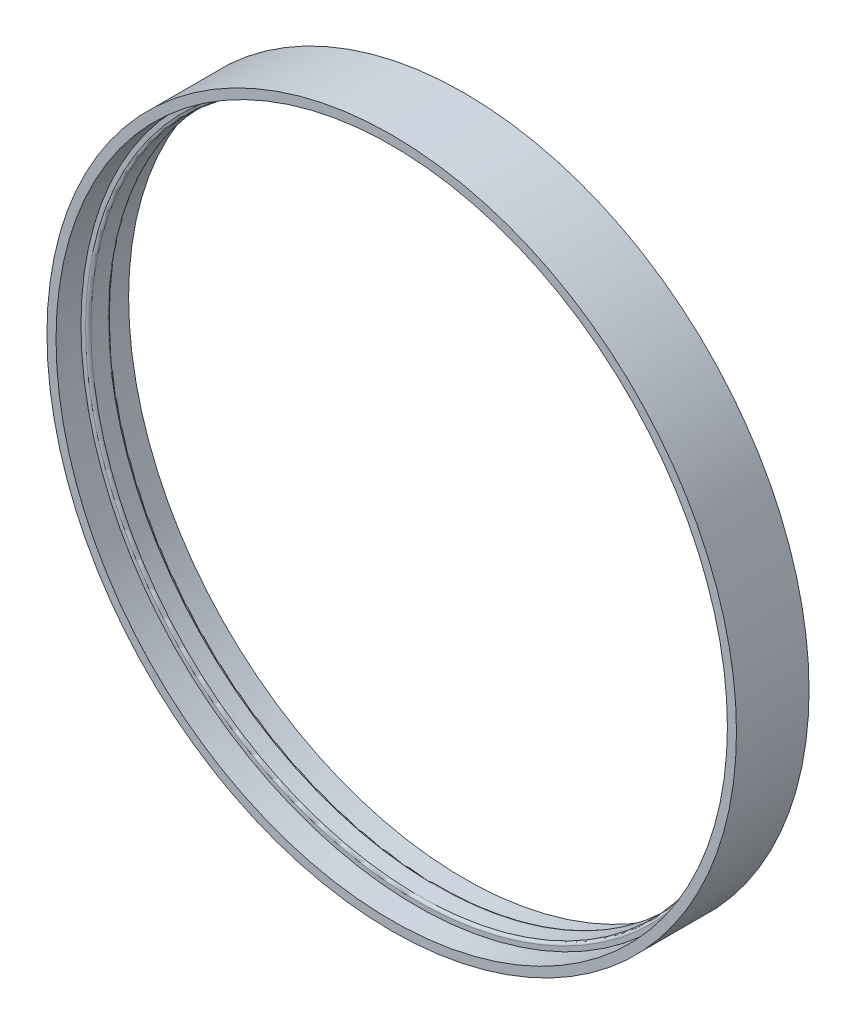
ISO-10303-21;
HEADER;
FILE_DESCRIPTION(('STEP AP214'),'2;1');
FILE_NAME('part.step','',(''),(''),'','','');
FILE_SCHEMA(('AUTOMOTIVE_DESIGN { 1 0 10303 214 1 1 1 1 }'));
ENDSEC;
DATA;
#1=APPLICATION_CONTEXT('core data for automotive mechanical design processes');
#2=APPLICATION_PROTOCOL_DEFINITION('international standard','automotive_design',2000,#1);
#3=PRODUCT_CONTEXT('',#1,'mechanical');
#4=PRODUCT('Part','Part','',(#3));
#5=PRODUCT_RELATED_PRODUCT_CATEGORY('part','',(#4));
#6=PRODUCT_DEFINITION_FORMATION('','',#4);
#7=PRODUCT_DEFINITION_CONTEXT('part definition',#1,'design');
#8=PRODUCT_DEFINITION('design','',#6,#7);
#9=PRODUCT_DEFINITION_SHAPE('','',#8);
#10=(LENGTH_UNIT() NAMED_UNIT(*) SI_UNIT(.MILLI.,.METRE.));
#11=(NAMED_UNIT(*) PLANE_ANGLE_UNIT() SI_UNIT($,.RADIAN.));
#12=(NAMED_UNIT(*) SI_UNIT($,.STERADIAN.) SOLID_ANGLE_UNIT());
#13=UNCERTAINTY_MEASURE_WITH_UNIT(LENGTH_MEASURE(1.E-05),#10,'distance_accuracy_value','');
#14=(GEOMETRIC_REPRESENTATION_CONTEXT(3) GLOBAL_UNCERTAINTY_ASSIGNED_CONTEXT((#13)) GLOBAL_UNIT_ASSIGNED_CONTEXT((#10,
#11,#12)) REPRESENTATION_CONTEXT('',''));
#15=CARTESIAN_POINT('',(0.,0.,0.));
#16=DIRECTION('',(0.,0.,1.));
#17=DIRECTION('',(1.,0.,0.));
#18=AXIS2_PLACEMENT_3D('',#15,#16,#17);
#19=CARTESIAN_POINT('',(0.,0.,-11.176));
#20=DIRECTION('',(0.,0.,-1.));
#21=DIRECTION('',(-1.,0.,0.));
#22=AXIS2_PLACEMENT_3D('',#19,#20,#21);
#23=CYLINDRICAL_SURFACE('',#22,93.98);
#24=CARTESIAN_POINT('',(0.,0.,-10.16));
#25=DIRECTION('',(0.,0.,-1.));
#26=DIRECTION('',(-1.,0.,0.));
#27=AXIS2_PLACEMENT_3D('',#24,#25,#26);
#28=CIRCLE('',#27,93.98);
#29=CARTESIAN_POINT('',(-93.98,0.,-10.16));
#30=VERTEX_POINT('',#29);
#31=EDGE_CURVE('E10',#30,#30,#28,.T.);
#32=ORIENTED_EDGE('',*,*,#31,.T.);
#33=EDGE_LOOP('',(#32));
#34=FACE_BOUND('',#33,.T.);
#35=CARTESIAN_POINT('',(0.,0.,-3.175));
#36=DIRECTION('',(0.,0.,-1.));
#37=DIRECTION('',(-1.,0.,0.));
#38=AXIS2_PLACEMENT_3D('',#35,#36,#37);
#39=CIRCLE('',#38,93.98);
#40=CARTESIAN_POINT('',(-93.98,0.,-3.175));
#41=VERTEX_POINT('',#40);
#42=EDGE_CURVE('E80',#41,#41,#39,.T.);
#43=ORIENTED_EDGE('',*,*,#42,.F.);
#44=EDGE_LOOP('',(#43));
#45=FACE_BOUND('',#44,.T.);
#46=ADVANCED_FACE('F37',(#34,#45),#23,.F.);
#47=CARTESIAN_POINT('',(0.,96.52,-10.16));
#48=DIRECTION('',(0.,0.,-1.));
#49=DIRECTION('',(-1.,0.,0.));
#50=AXIS2_PLACEMENT_3D('',#47,#48,#49);
#51=PLANE('',#50);
#52=CARTESIAN_POINT('',(0.,0.,-10.16));
#53=DIRECTION('',(0.,0.,-1.));
#54=DIRECTION('',(-1.,0.,0.));
#55=AXIS2_PLACEMENT_3D('',#52,#53,#54);
#56=CIRCLE('',#55,96.52);
#57=CARTESIAN_POINT('',(-96.52,0.,-10.16));
#58=VERTEX_POINT('',#57);
#59=EDGE_CURVE('E44',#58,#58,#56,.T.);
#60=ORIENTED_EDGE('',*,*,#59,.T.);
#61=EDGE_LOOP('',(#60));
#62=FACE_BOUND('',#61,.T.);
#63=ORIENTED_EDGE('',*,*,#31,.F.);
#64=EDGE_LOOP('',(#63));
#65=FACE_BOUND('',#64,.T.);
#66=ADVANCED_FACE('F89',(#62,#65),#51,.T.);
#67=CARTESIAN_POINT('',(0.,0.,-11.176));
#68=DIRECTION('',(0.,0.,-1.));
#69=DIRECTION('',(-1.,0.,0.));
#70=AXIS2_PLACEMENT_3D('',#67,#68,#69);
#71=CYLINDRICAL_SURFACE('',#70,96.52);
#72=CARTESIAN_POINT('',(0.,0.,10.16));
#73=DIRECTION('',(0.,0.,-1.));
#74=DIRECTION('',(-1.,0.,0.));
#75=AXIS2_PLACEMENT_3D('',#72,#73,#74);
#76=CIRCLE('',#75,96.52);
#77=CARTESIAN_POINT('',(-96.52,0.,10.16));
#78=VERTEX_POINT('',#77);
#79=EDGE_CURVE('E49',#78,#78,#76,.T.);
#80=ORIENTED_EDGE('',*,*,#79,.T.);
#81=EDGE_LOOP('',(#80));
#82=FACE_BOUND('',#81,.T.);
#83=ORIENTED_EDGE('',*,*,#59,.F.);
#84=EDGE_LOOP('',(#83));
#85=FACE_BOUND('',#84,.T.);
#86=ADVANCED_FACE('F93',(#82,#85),#71,.T.);
#87=CARTESIAN_POINT('',(0.,96.52,10.16));
#88=DIRECTION('',(0.,0.,1.));
#89=DIRECTION('',(1.,0.,0.));
#90=AXIS2_PLACEMENT_3D('',#87,#88,#89);
#91=PLANE('',#90);
#92=CARTESIAN_POINT('',(0.,0.,10.16));
#93=DIRECTION('',(0.,0.,-1.));
#94=DIRECTION('',(-1.,0.,0.));
#95=AXIS2_PLACEMENT_3D('',#92,#93,#94);
#96=CIRCLE('',#95,93.98);
#97=CARTESIAN_POINT('',(-93.98,0.,10.16));
#98=VERTEX_POINT('',#97);
#99=EDGE_CURVE('E54',#98,#98,#96,.T.);
#100=ORIENTED_EDGE('',*,*,#99,.T.);
#101=EDGE_LOOP('',(#100));
#102=FACE_BOUND('',#101,.T.);
#103=ORIENTED_EDGE('',*,*,#79,.F.);
#104=EDGE_LOOP('',(#103));
#105=FACE_BOUND('',#104,.T.);
#106=ADVANCED_FACE('F97',(#102,#105),#91,.T.);
#107=CARTESIAN_POINT('',(0.,0.,-11.176));
#108=DIRECTION('',(0.,0.,-1.));
#109=DIRECTION('',(-1.,0.,0.));
#110=AXIS2_PLACEMENT_3D('',#107,#108,#109);
#111=CYLINDRICAL_SURFACE('',#110,93.98);
#112=CARTESIAN_POINT('',(0.,0.,3.175));
#113=DIRECTION('',(0.,0.,-1.));
#114=DIRECTION('',(-1.,0.,0.));
#115=AXIS2_PLACEMENT_3D('',#112,#113,#114);
#116=CIRCLE('',#115,93.98);
#117=CARTESIAN_POINT('',(-93.98,0.,3.175));
#118=VERTEX_POINT('',#117);
#119=EDGE_CURVE('E60',#118,#118,#116,.T.);
#120=ORIENTED_EDGE('',*,*,#119,.T.);
#121=EDGE_LOOP('',(#120));
#122=FACE_BOUND('',#121,.T.);
#123=ORIENTED_EDGE('',*,*,#99,.F.);
#124=EDGE_LOOP('',(#123));
#125=FACE_BOUND('',#124,.T.);
#126=ADVANCED_FACE('F104',(#122,#125),#111,.F.);
#127=CARTESIAN_POINT('',(0.,93.98,3.175));
#128=DIRECTION('',(0.,0.,1.));
#129=DIRECTION('',(1.,0.,0.));
#130=AXIS2_PLACEMENT_3D('',#127,#128,#129);
#131=PLANE('',#130);
#132=CARTESIAN_POINT('',(0.,0.,3.175));
#133=DIRECTION('',(0.,0.,-1.));
#134=DIRECTION('',(-1.,0.,0.));
#135=AXIS2_PLACEMENT_3D('',#132,#133,#134);
#136=CIRCLE('',#135,92.71);
#137=CARTESIAN_POINT('',(-92.71,0.,3.175));
#138=VERTEX_POINT('',#137);
#139=EDGE_CURVE('E64',#138,#138,#136,.T.);
#140=ORIENTED_EDGE('',*,*,#139,.T.);
#141=EDGE_LOOP('',(#140));
#142=FACE_BOUND('',#141,.T.);
#143=ORIENTED_EDGE('',*,*,#119,.F.);
#144=EDGE_LOOP('',(#143));
#145=FACE_BOUND('',#144,.T.);
#146=ADVANCED_FACE('F108',(#142,#145),#131,.T.);
#147=CARTESIAN_POINT('',(0.,0.,2.413));
#148=DIRECTION('',(0.,0.,-1.));
#149=DIRECTION('',(-1.,0.,0.));
#150=AXIS2_PLACEMENT_3D('',#147,#148,#149);
#151=TOROIDAL_SURFACE('',#150,92.71,0.761999999999999);
#152=CARTESIAN_POINT('',(0.,0.,2.41299999999999));
#153=DIRECTION('',(0.,0.,-1.));
#154=DIRECTION('',(-1.,0.,0.));
#155=AXIS2_PLACEMENT_3D('',#152,#153,#154);
#156=CIRCLE('',#155,91.948);
#157=CARTESIAN_POINT('',(-91.948,0.,2.41299999999999));
#158=VERTEX_POINT('',#157);
#159=EDGE_CURVE('E68',#158,#158,#156,.T.);
#160=ORIENTED_EDGE('',*,*,#159,.T.);
#161=EDGE_LOOP('',(#160));
#162=FACE_BOUND('',#161,.T.);
#163=ORIENTED_EDGE('',*,*,#139,.F.);
#164=EDGE_LOOP('',(#163));
#165=FACE_BOUND('',#164,.T.);
#166=ADVANCED_FACE('F112',(#162,#165),#151,.T.);
#167=CARTESIAN_POINT('',(0.,0.,-11.176));
#168=DIRECTION('',(0.,0.,-1.));
#169=DIRECTION('',(-1.,0.,0.));
#170=AXIS2_PLACEMENT_3D('',#167,#168,#169);
#171=CYLINDRICAL_SURFACE('',#170,91.948);
#172=CARTESIAN_POINT('',(0.,0.,-2.41299999999999));
#173=DIRECTION('',(0.,0.,-1.));
#174=DIRECTION('',(-1.,0.,0.));
#175=AXIS2_PLACEMENT_3D('',#172,#173,#174);
#176=CIRCLE('',#175,91.948);
#177=CARTESIAN_POINT('',(-91.948,0.,-2.41299999999999));
#178=VERTEX_POINT('',#177);
#179=EDGE_CURVE('E72',#178,#178,#176,.T.);
#180=ORIENTED_EDGE('',*,*,#179,.T.);
#181=EDGE_LOOP('',(#180));
#182=FACE_BOUND('',#181,.T.);
#183=ORIENTED_EDGE('',*,*,#159,.F.);
#184=EDGE_LOOP('',(#183));
#185=FACE_BOUND('',#184,.T.);
#186=ADVANCED_FACE('F116',(#182,#185),#171,.F.);
#187=CARTESIAN_POINT('',(0.,0.,-2.413));
#188=DIRECTION('',(0.,0.,-1.));
#189=DIRECTION('',(-1.,0.,0.));
#190=AXIS2_PLACEMENT_3D('',#187,#188,#189);
#191=TOROIDAL_SURFACE('',#190,92.71,0.761999999999999);
#192=CARTESIAN_POINT('',(0.,0.,-3.175));
#193=DIRECTION('',(0.,0.,-1.));
#194=DIRECTION('',(-1.,0.,0.));
#195=AXIS2_PLACEMENT_3D('',#192,#193,#194);
#196=CIRCLE('',#195,92.71);
#197=CARTESIAN_POINT('',(-92.71,0.,-3.175));
#198=VERTEX_POINT('',#197);
#199=EDGE_CURVE('E76',#198,#198,#196,.T.);
#200=ORIENTED_EDGE('',*,*,#199,.T.);
#201=EDGE_LOOP('',(#200));
#202=FACE_BOUND('',#201,.T.);
#203=ORIENTED_EDGE('',*,*,#179,.F.);
#204=EDGE_LOOP('',(#203));
#205=FACE_BOUND('',#204,.T.);
#206=ADVANCED_FACE('F120',(#202,#205),#191,.T.);
#207=CARTESIAN_POINT('',(0.,93.98,-3.175));
#208=DIRECTION('',(0.,0.,-1.));
#209=DIRECTION('',(-1.,0.,0.));
#210=AXIS2_PLACEMENT_3D('',#207,#208,#209);
#211=PLANE('',#210);
#212=ORIENTED_EDGE('',*,*,#42,.T.);
#213=EDGE_LOOP('',(#212));
#214=FACE_BOUND('',#213,.T.);
#215=ORIENTED_EDGE('',*,*,#199,.F.);
#216=EDGE_LOOP('',(#215));
#217=FACE_BOUND('',#216,.T.);
#218=ADVANCED_FACE('F85',(#214,#217),#211,.T.);
#219=CLOSED_SHELL('',(#46,#66,#86,#106,#126,#146,#166,#186,#206,#218));
#220=MANIFOLD_SOLID_BREP('B2',#219);
#221=ADVANCED_BREP_SHAPE_REPRESENTATION('',(#18,#220),#14);
#222=SHAPE_DEFINITION_REPRESENTATION(#9,#221);
ENDSEC;
END-ISO-10303-21;
